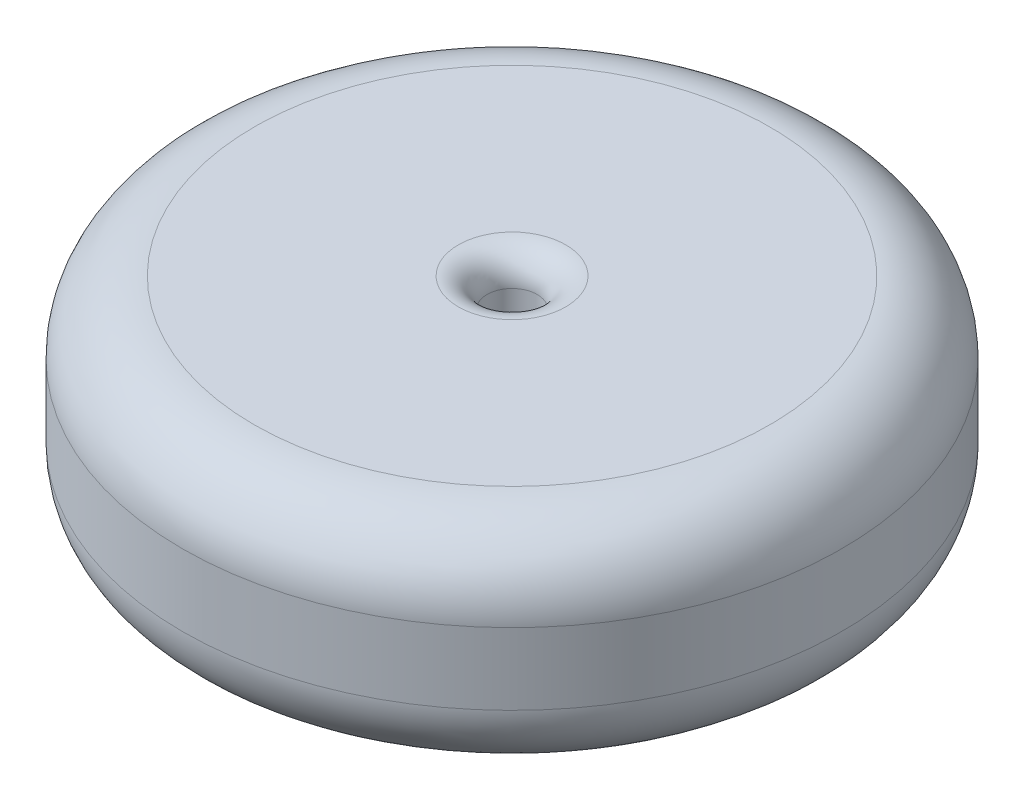
ISO-10303-21;
HEADER;
FILE_DESCRIPTION(('STEP AP214'),'2;1');
FILE_NAME('part.step','',(''),(''),'','','');
FILE_SCHEMA(('AUTOMOTIVE_DESIGN { 1 0 10303 214 1 1 1 1 }'));
ENDSEC;
DATA;
#1=APPLICATION_CONTEXT('core data for automotive mechanical design processes');
#2=APPLICATION_PROTOCOL_DEFINITION('international standard','automotive_design',2000,#1);
#3=PRODUCT_CONTEXT('',#1,'mechanical');
#4=PRODUCT('Part','Part','',(#3));
#5=PRODUCT_RELATED_PRODUCT_CATEGORY('part','',(#4));
#6=PRODUCT_DEFINITION_FORMATION('','',#4);
#7=PRODUCT_DEFINITION_CONTEXT('part definition',#1,'design');
#8=PRODUCT_DEFINITION('design','',#6,#7);
#9=PRODUCT_DEFINITION_SHAPE('','',#8);
#10=(LENGTH_UNIT() NAMED_UNIT(*) SI_UNIT(.MILLI.,.METRE.));
#11=(NAMED_UNIT(*) PLANE_ANGLE_UNIT() SI_UNIT($,.RADIAN.));
#12=(NAMED_UNIT(*) SI_UNIT($,.STERADIAN.) SOLID_ANGLE_UNIT());
#13=UNCERTAINTY_MEASURE_WITH_UNIT(LENGTH_MEASURE(1.E-05),#10,'distance_accuracy_value','');
#14=(GEOMETRIC_REPRESENTATION_CONTEXT(3) GLOBAL_UNCERTAINTY_ASSIGNED_CONTEXT((#13)) GLOBAL_UNIT_ASSIGNED_CONTEXT((#10,
#11,#12)) REPRESENTATION_CONTEXT('',''));
#15=CARTESIAN_POINT('',(0.,0.,0.));
#16=DIRECTION('',(0.,0.,1.));
#17=DIRECTION('',(1.,0.,0.));
#18=AXIS2_PLACEMENT_3D('',#15,#16,#17);
#19=CARTESIAN_POINT('',(0.,15.,0.));
#20=DIRECTION('',(0.,1.,0.));
#21=DIRECTION('',(0.,0.,1.));
#22=AXIS2_PLACEMENT_3D('',#19,#20,#21);
#23=PLANE('',#22);
#24=CARTESIAN_POINT('',(0.,15.,0.));
#25=DIRECTION('',(0.,1.,0.));
#26=DIRECTION('',(0.,0.,1.));
#27=AXIS2_PLACEMENT_3D('',#24,#25,#26);
#28=CIRCLE('',#27,18.);
#29=CARTESIAN_POINT('',(0.,15.,18.));
#30=VERTEX_POINT('',#29);
#31=EDGE_CURVE('E10',#30,#30,#28,.T.);
#32=ORIENTED_EDGE('',*,*,#31,.T.);
#33=EDGE_LOOP('',(#32));
#34=FACE_BOUND('',#33,.T.);
#35=CARTESIAN_POINT('',(0.,15.,0.));
#36=DIRECTION('',(0.,1.,0.));
#37=DIRECTION('',(0.,0.,1.));
#38=AXIS2_PLACEMENT_3D('',#35,#36,#37);
#39=CIRCLE('',#38,3.75);
#40=CARTESIAN_POINT('',(0.,15.,3.75));
#41=VERTEX_POINT('',#40);
#42=EDGE_CURVE('E65',#41,#41,#39,.F.);
#43=ORIENTED_EDGE('',*,*,#42,.T.);
#44=EDGE_LOOP('',(#43));
#45=FACE_BOUND('',#44,.T.);
#46=ADVANCED_FACE('F41',(#34,#45),#23,.T.);
#47=CARTESIAN_POINT('',(0.,0.,0.));
#48=DIRECTION('',(0.,1.,0.));
#49=DIRECTION('',(0.,0.,1.));
#50=AXIS2_PLACEMENT_3D('',#47,#48,#49);
#51=PLANE('',#50);
#52=CARTESIAN_POINT('',(0.,0.,0.));
#53=DIRECTION('',(0.,1.,0.));
#54=DIRECTION('',(0.,0.,1.));
#55=AXIS2_PLACEMENT_3D('',#52,#53,#54);
#56=CIRCLE('',#55,18.);
#57=CARTESIAN_POINT('',(0.,0.,18.));
#58=VERTEX_POINT('',#57);
#59=EDGE_CURVE('E49',#58,#58,#56,.F.);
#60=ORIENTED_EDGE('',*,*,#59,.T.);
#61=EDGE_LOOP('',(#60));
#62=FACE_BOUND('',#61,.T.);
#63=CARTESIAN_POINT('',(0.,0.,0.));
#64=DIRECTION('',(0.,1.,0.));
#65=DIRECTION('',(0.,0.,1.));
#66=AXIS2_PLACEMENT_3D('',#63,#64,#65);
#67=CIRCLE('',#66,3.75);
#68=CARTESIAN_POINT('',(0.,0.,3.75));
#69=VERTEX_POINT('',#68);
#70=EDGE_CURVE('E77',#69,#69,#67,.T.);
#71=ORIENTED_EDGE('',*,*,#70,.T.);
#72=EDGE_LOOP('',(#71));
#73=FACE_BOUND('',#72,.T.);
#74=ADVANCED_FACE('F82',(#62,#73),#51,.F.);
#75=CARTESIAN_POINT('',(0.,15.,0.));
#76=DIRECTION('',(0.,-1.,0.));
#77=DIRECTION('',(0.,0.,-1.));
#78=AXIS2_PLACEMENT_3D('',#75,#76,#77);
#79=CYLINDRICAL_SURFACE('',#78,23.);
#80=CARTESIAN_POINT('',(0.,5.,0.));
#81=DIRECTION('',(0.,1.,0.));
#82=DIRECTION('',(0.,0.,1.));
#83=AXIS2_PLACEMENT_3D('',#80,#81,#82);
#84=CIRCLE('',#83,23.);
#85=CARTESIAN_POINT('',(0.,5.,23.));
#86=VERTEX_POINT('',#85);
#87=EDGE_CURVE('E54',#86,#86,#84,.T.);
#88=ORIENTED_EDGE('',*,*,#87,.T.);
#89=EDGE_LOOP('',(#88));
#90=FACE_BOUND('',#89,.T.);
#91=CARTESIAN_POINT('',(0.,10.,0.));
#92=DIRECTION('',(0.,1.,0.));
#93=DIRECTION('',(0.,0.,1.));
#94=AXIS2_PLACEMENT_3D('',#91,#92,#93);
#95=CIRCLE('',#94,23.);
#96=CARTESIAN_POINT('',(0.,10.,23.));
#97=VERTEX_POINT('',#96);
#98=EDGE_CURVE('E59',#97,#97,#95,.F.);
#99=ORIENTED_EDGE('',*,*,#98,.T.);
#100=EDGE_LOOP('',(#99));
#101=FACE_BOUND('',#100,.T.);
#102=ADVANCED_FACE('F97',(#90,#101),#79,.T.);
#103=CARTESIAN_POINT('',(0.,15.,0.));
#104=DIRECTION('',(0.,-1.,0.));
#105=DIRECTION('',(0.,0.,-1.));
#106=AXIS2_PLACEMENT_3D('',#103,#104,#105);
#107=CYLINDRICAL_SURFACE('',#106,1.75);
#108=CARTESIAN_POINT('',(0.,2.,0.));
#109=DIRECTION('',(0.,1.,0.));
#110=DIRECTION('',(0.,0.,1.));
#111=AXIS2_PLACEMENT_3D('',#108,#109,#110);
#112=CIRCLE('',#111,1.75);
#113=CARTESIAN_POINT('',(0.,2.,1.75));
#114=VERTEX_POINT('',#113);
#115=EDGE_CURVE('E69',#114,#114,#112,.F.);
#116=ORIENTED_EDGE('',*,*,#115,.T.);
#117=EDGE_LOOP('',(#116));
#118=FACE_BOUND('',#117,.T.);
#119=CARTESIAN_POINT('',(0.,13.,0.));
#120=DIRECTION('',(0.,1.,0.));
#121=DIRECTION('',(0.,0.,1.));
#122=AXIS2_PLACEMENT_3D('',#119,#120,#121);
#123=CIRCLE('',#122,1.75);
#124=CARTESIAN_POINT('',(0.,13.,1.75));
#125=VERTEX_POINT('',#124);
#126=EDGE_CURVE('E73',#125,#125,#123,.T.);
#127=ORIENTED_EDGE('',*,*,#126,.T.);
#128=EDGE_LOOP('',(#127));
#129=FACE_BOUND('',#128,.T.);
#130=ADVANCED_FACE('F87',(#118,#129),#107,.F.);
#131=CARTESIAN_POINT('',(0.,2.,0.));
#132=DIRECTION('',(0.,1.,0.));
#133=DIRECTION('',(0.,0.,1.));
#134=AXIS2_PLACEMENT_3D('',#131,#132,#133);
#135=TOROIDAL_SURFACE('',#134,3.75,2.);
#136=ORIENTED_EDGE('',*,*,#115,.F.);
#137=EDGE_LOOP('',(#136));
#138=FACE_BOUND('',#137,.T.);
#139=ORIENTED_EDGE('',*,*,#70,.F.);
#140=EDGE_LOOP('',(#139));
#141=FACE_BOUND('',#140,.T.);
#142=ADVANCED_FACE('F84',(#138,#141),#135,.T.);
#143=CARTESIAN_POINT('',(0.,13.,0.));
#144=DIRECTION('',(0.,1.,0.));
#145=DIRECTION('',(0.,0.,1.));
#146=AXIS2_PLACEMENT_3D('',#143,#144,#145);
#147=TOROIDAL_SURFACE('',#146,3.75,2.);
#148=ORIENTED_EDGE('',*,*,#42,.F.);
#149=EDGE_LOOP('',(#148));
#150=FACE_BOUND('',#149,.T.);
#151=ORIENTED_EDGE('',*,*,#126,.F.);
#152=EDGE_LOOP('',(#151));
#153=FACE_BOUND('',#152,.T.);
#154=ADVANCED_FACE('F86',(#150,#153),#147,.T.);
#155=CARTESIAN_POINT('',(0.,5.,0.));
#156=DIRECTION('',(0.,1.,0.));
#157=DIRECTION('',(0.,0.,1.));
#158=AXIS2_PLACEMENT_3D('',#155,#156,#157);
#159=TOROIDAL_SURFACE('',#158,18.,5.);
#160=ORIENTED_EDGE('',*,*,#59,.F.);
#161=EDGE_LOOP('',(#160));
#162=FACE_BOUND('',#161,.T.);
#163=ORIENTED_EDGE('',*,*,#87,.F.);
#164=EDGE_LOOP('',(#163));
#165=FACE_BOUND('',#164,.T.);
#166=ADVANCED_FACE('F94',(#162,#165),#159,.T.);
#167=CARTESIAN_POINT('',(0.,10.,0.));
#168=DIRECTION('',(0.,1.,0.));
#169=DIRECTION('',(0.,0.,1.));
#170=AXIS2_PLACEMENT_3D('',#167,#168,#169);
#171=TOROIDAL_SURFACE('',#170,18.,5.);
#172=ORIENTED_EDGE('',*,*,#98,.F.);
#173=EDGE_LOOP('',(#172));
#174=FACE_BOUND('',#173,.T.);
#175=ORIENTED_EDGE('',*,*,#31,.F.);
#176=EDGE_LOOP('',(#175));
#177=FACE_BOUND('',#176,.T.);
#178=ADVANCED_FACE('F43',(#174,#177),#171,.T.);
#179=CLOSED_SHELL('',(#46,#74,#102,#130,#142,#154,#166,#178));
#180=MANIFOLD_SOLID_BREP('B2',#179);
#181=ADVANCED_BREP_SHAPE_REPRESENTATION('',(#18,#180),#14);
#182=SHAPE_DEFINITION_REPRESENTATION(#9,#181);
ENDSEC;
END-ISO-10303-21;
